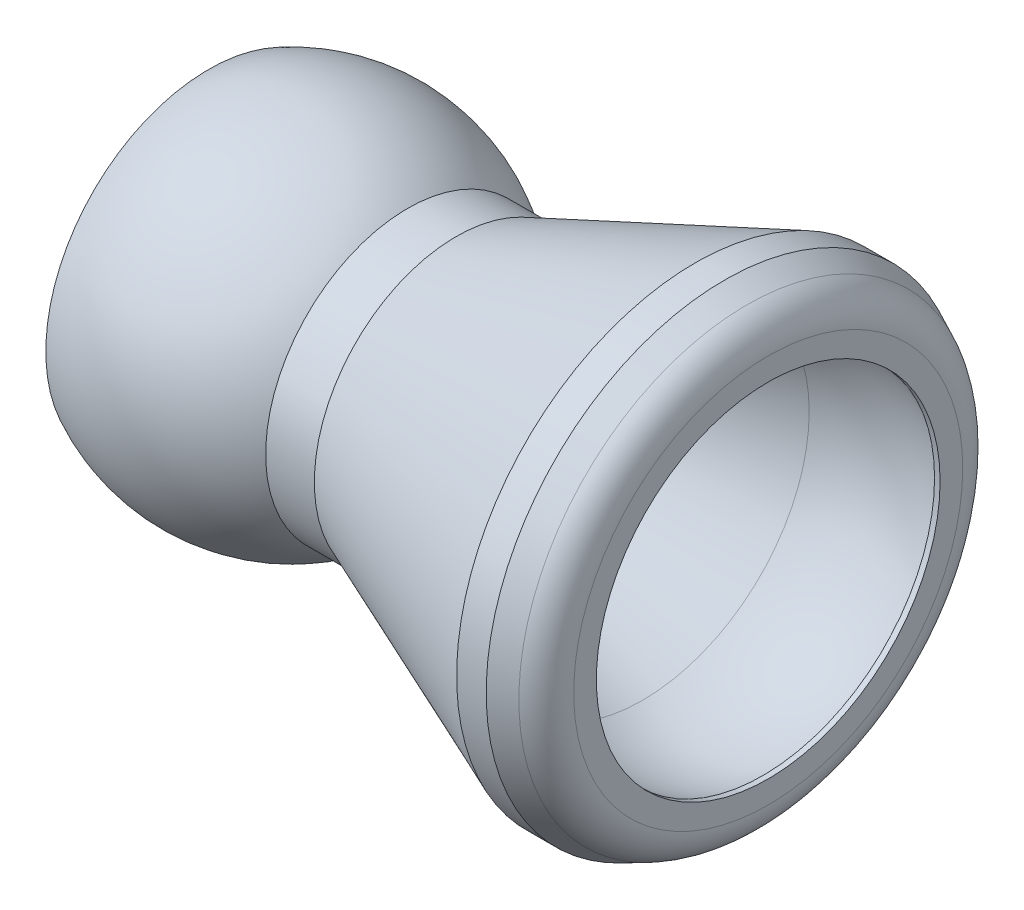
ISO-10303-21;
HEADER;
FILE_DESCRIPTION(('STEP AP214'),'2;1');
FILE_NAME('part.step','',(''),(''),'','','');
FILE_SCHEMA(('AUTOMOTIVE_DESIGN { 1 0 10303 214 1 1 1 1 }'));
ENDSEC;
DATA;
#1=APPLICATION_CONTEXT('core data for automotive mechanical design processes');
#2=APPLICATION_PROTOCOL_DEFINITION('international standard','automotive_design',2000,#1);
#3=PRODUCT_CONTEXT('',#1,'mechanical');
#4=PRODUCT('Part','Part','',(#3));
#5=PRODUCT_RELATED_PRODUCT_CATEGORY('part','',(#4));
#6=PRODUCT_DEFINITION_FORMATION('','',#4);
#7=PRODUCT_DEFINITION_CONTEXT('part definition',#1,'design');
#8=PRODUCT_DEFINITION('design','',#6,#7);
#9=PRODUCT_DEFINITION_SHAPE('','',#8);
#10=(LENGTH_UNIT() NAMED_UNIT(*) SI_UNIT(.MILLI.,.METRE.));
#11=(NAMED_UNIT(*) PLANE_ANGLE_UNIT() SI_UNIT($,.RADIAN.));
#12=(NAMED_UNIT(*) SI_UNIT($,.STERADIAN.) SOLID_ANGLE_UNIT());
#13=UNCERTAINTY_MEASURE_WITH_UNIT(LENGTH_MEASURE(1.E-05),#10,'distance_accuracy_value','');
#14=(GEOMETRIC_REPRESENTATION_CONTEXT(3) GLOBAL_UNCERTAINTY_ASSIGNED_CONTEXT((#13)) GLOBAL_UNIT_ASSIGNED_CONTEXT((#10,
#11,#12)) REPRESENTATION_CONTEXT('',''));
#15=CARTESIAN_POINT('',(0.,0.,0.));
#16=DIRECTION('',(0.,0.,1.));
#17=DIRECTION('',(1.,0.,0.));
#18=AXIS2_PLACEMENT_3D('',#15,#16,#17);
#19=CARTESIAN_POINT('',(-2.0066,0.,0.));
#20=DIRECTION('',(1.,0.,0.));
#21=DIRECTION('',(0.,0.,-1.));
#22=AXIS2_PLACEMENT_3D('',#19,#20,#21);
#23=SPHERICAL_SURFACE('',#22,6.17855);
#24=CARTESIAN_POINT('',(-4.32112556774985,0.,0.));
#25=DIRECTION('',(1.,0.,0.));
#26=DIRECTION('',(0.,0.,-1.));
#27=AXIS2_PLACEMENT_3D('',#24,#25,#26);
#28=CIRCLE('',#27,5.72865180463364);
#29=CARTESIAN_POINT('',(-4.32112556774985,0.,-5.72865180463364));
#30=VERTEX_POINT('',#29);
#31=EDGE_CURVE('E63',#30,#30,#28,.T.);
#32=CARTESIAN_POINT('',(-0.19013369078863,0.,0.));
#33=DIRECTION('',(1.,0.,0.));
#34=DIRECTION('',(0.,0.,-1.));
#35=AXIS2_PLACEMENT_3D('',#32,#33,#34);
#36=CIRCLE('',#35,5.9055);
#37=CARTESIAN_POINT('',(-0.19013369078863,0.,-5.9055));
#38=VERTEX_POINT('',#37);
#39=EDGE_CURVE('E9',#38,#38,#36,.T.);
#40=CARTESIAN_POINT('',(-4.32112556774985,0.,-5.72865180463364));
#41=CARTESIAN_POINT('',(-4.28040580624834,0.,-5.74510373864249));
#42=CARTESIAN_POINT('',(-4.2395105790668,0.,-5.7611213723148));
#43=CARTESIAN_POINT('',(-4.15738790785352,0.,-5.79228106964023));
#44=CARTESIAN_POINT('',(-4.11616046382178,0.,-5.80742313329335));
#45=CARTESIAN_POINT('',(-4.03339207341796,0.,-5.83682472123424));
#46=CARTESIAN_POINT('',(-3.99185112704587,0.,-5.85108424552203));
#47=CARTESIAN_POINT('',(-3.90847462949993,0.,-5.87871429336167));
#48=CARTESIAN_POINT('',(-3.86663907832606,0.,-5.89208481691354));
#49=CARTESIAN_POINT('',(-3.78269239182846,0.,-5.91793077756185));
#50=CARTESIAN_POINT('',(-3.74058125650471,0.,-5.93040621465829));
#51=CARTESIAN_POINT('',(-3.65610255057554,0.,-5.95445633133802));
#52=CARTESIAN_POINT('',(-3.61373497997011,0.,-5.9660310109213));
#53=CARTESIAN_POINT('',(-3.52876266817017,0.,-5.98827434904603));
#54=CARTESIAN_POINT('',(-3.48615792697566,0.,-5.99894300758747));
#55=CARTESIAN_POINT('',(-3.40073064674207,0.,-6.0193694526244));
#56=CARTESIAN_POINT('',(-3.357908107703,0.,-6.02912723911989));
#57=CARTESIAN_POINT('',(-3.27206470350322,0.,-6.04772750309391));
#58=CARTESIAN_POINT('',(-3.22904383834253,0.,-6.05656998057243));
#59=CARTESIAN_POINT('',(-3.14282334381785,0.,-6.073335605779));
#60=CARTESIAN_POINT('',(-3.09962371445386,0.,-6.08125875350703));
#61=CARTESIAN_POINT('',(-3.01306533472236,0.,-6.09618211649473));
#62=CARTESIAN_POINT('',(-2.96970658435485,0.,-6.10318233175439));
#63=CARTESIAN_POINT('',(-2.88284967817066,0.,-6.11625664675474));
#64=CARTESIAN_POINT('',(-2.83935152235398,0.,-6.12233074649542));
#65=CARTESIAN_POINT('',(-2.75223558421426,0.,-6.13355006851821));
#66=CARTESIAN_POINT('',(-2.70861780189122,0.,-6.13869529080032));
#67=CARTESIAN_POINT('',(-2.62128244407674,0.,-6.14805451833423));
#68=CARTESIAN_POINT('',(-2.5775648685853,0.,-6.15226852358604));
#69=CARTESIAN_POINT('',(-2.49004980314867,0.,-6.15976340091904));
#70=CARTESIAN_POINT('',(-2.44625231320348,0.,-6.16304427300023));
#71=CARTESIAN_POINT('',(-2.35859733391172,0.,-6.16867139215449));
#72=CARTESIAN_POINT('',(-2.31473984456515,0.,-6.17101763922755));
#73=CARTESIAN_POINT('',(-2.22698480880519,0.,-6.1747744415091));
#74=CARTESIAN_POINT('',(-2.1830872623918,0.,-6.1761849967176));
#75=CARTESIAN_POINT('',(-2.095272073047,0.,-6.17806977387984));
#76=CARTESIAN_POINT('',(-2.05135443011559,0.,-6.17854399583358));
#77=CARTESIAN_POINT('',(-1.9635190174216,0.,-6.17855589085396));
#78=CARTESIAN_POINT('',(-1.91960124765902,0.,-6.17809356392061));
#79=CARTESIAN_POINT('',(-1.83178555104721,0.,-6.17623257139039));
#80=CARTESIAN_POINT('',(-1.78788762419798,0.,-6.17483390579352));
#81=CARTESIAN_POINT('',(-1.70013157413467,0.,-6.17110087192015));
#82=CARTESIAN_POINT('',(-1.65627345092059,0.,-6.16876650364364));
#83=CARTESIAN_POINT('',(-1.56861695075032,0.,-6.16316312586618));
#84=CARTESIAN_POINT('',(-1.52481857379412,0.,-6.15989411636523));
#85=CARTESIAN_POINT('',(-1.4373014815955,0.,-6.15242294258179));
#86=CARTESIAN_POINT('',(-1.39358276635306,0.,-6.14822077829931));
#87=CARTESIAN_POINT('',(-1.30624487681422,0.,-6.13888520571123));
#88=CARTESIAN_POINT('',(-1.2626257025178,0.,-6.13375179740563));
#89=CARTESIAN_POINT('',(-1.17550672884432,0.,-6.1225560709626));
#90=CARTESIAN_POINT('',(-1.13200692946724,0.,-6.11649375282517));
#91=CARTESIAN_POINT('',(-1.04514648531354,0.,-6.10344296333276));
#92=CARTESIAN_POINT('',(-1.0017858405369,0.,-6.09645449197778));
#93=CARTESIAN_POINT('',(-0.9152234220336,0.,-6.08155457364188));
#94=CARTESIAN_POINT('',(-0.872021648306938,0.,-6.07364312666097));
#95=CARTESIAN_POINT('',(-0.785796615952367,0.,-6.0569008549146));
#96=CARTESIAN_POINT('',(-0.742773357324458,0.,-6.04807003014914));
#97=CARTESIAN_POINT('',(-0.65692491864444,0.,-6.02949301661185));
#98=CARTESIAN_POINT('',(-0.614099738592331,0.,-6.01974682784001));
#99=CARTESIAN_POINT('',(-0.528666928232228,0.,-5.99934352417063));
#100=CARTESIAN_POINT('',(-0.486059297924234,0.,-5.98868640927307));
#101=CARTESIAN_POINT('',(-0.40108096766228,0.,-5.96646607603127));
#102=CARTESIAN_POINT('',(-0.35871026770832,0.,-5.95490285768703));
#103=CARTESIAN_POINT('',(-0.274225039818692,0.,-5.93087566199019));
#104=CARTESIAN_POINT('',(-0.232110511883024,0.,-5.9184116846376));
#105=CARTESIAN_POINT('',(-0.19013369078863,0.,-5.9055));
#106=B_SPLINE_CURVE_WITH_KNOTS('',3,(#40,#41,#42,#43,#44,#45,#46,#47,#48,#49,#50,#51,#52,#53,
#54,#55,#56,#57,#58,#59,#60,#61,#62,#63,#64,#65,#66,#67,#68,#69,#70,#71,#72,#73,#74,#75,#76,#77,
#78,#79,#80,#81,#82,#83,#84,#85,#86,#87,#88,#89,#90,#91,#92,#93,#94,#95,#96,#97,#98,#99,#100,
#101,#102,#103,#104,#105),.UNSPECIFIED.,.F.,.F.,(4,2,2,2,2,2,2,2,2,2,2,2,2,2,2,2,2,2,2,2,2,2,2,
2,2,2,2,2,2,2,2,2,4),(0.,0.131750624105606,0.263501248211212,0.395251872316817,
0.527002496422423,0.658753120528028,0.790503744633634,0.922254368739239,1.05400499284484,
1.18575561695045,1.31750624105606,1.44925686516166,1.58100748926727,1.71275811337287,
1.84450873747848,1.97625936158408,2.10800998568969,2.23976060979529,2.3715112339009,
2.50326185800651,2.63501248211211,2.76676310621772,2.89851373032332,3.03026435442893,
3.16201497853453,3.29376560264014,3.42551622674574,3.55726685085135,3.68901747495695,
3.82076809906256,3.95251872316817,4.08426934727377,4.21601997137938),.UNSPECIFIED.);
#107=EDGE_CURVE('BSEAM14',#30,#38,#106,.T.);
#108=ORIENTED_EDGE('',*,*,#31,.F.);
#109=ORIENTED_EDGE('',*,*,#39,.T.);
#110=ORIENTED_EDGE('',*,*,#107,.T.);
#111=ORIENTED_EDGE('',*,*,#107,.F.);
#112=EDGE_LOOP('',(#108,#110,#109,#111));
#113=FACE_BOUND('',#112,.T.);
#114=ADVANCED_FACE('F14',(#113),#23,.F.);
#115=CARTESIAN_POINT('',(0.,0.,0.));
#116=DIRECTION('',(1.,0.,0.));
#117=DIRECTION('',(0.,0.,-1.));
#118=AXIS2_PLACEMENT_3D('',#115,#116,#117);
#119=CYLINDRICAL_SURFACE('',#118,5.9055);
#120=ORIENTED_EDGE('',*,*,#39,.F.);
#121=EDGE_LOOP('',(#120));
#122=FACE_BOUND('',#121,.T.);
#123=CARTESIAN_POINT('',(0.,0.,0.));
#124=DIRECTION('',(1.,0.,0.));
#125=DIRECTION('',(0.,0.,-1.));
#126=AXIS2_PLACEMENT_3D('',#123,#124,#125);
#127=CIRCLE('',#126,5.9055);
#128=CARTESIAN_POINT('',(0.,0.,-5.9055));
#129=VERTEX_POINT('',#128);
#130=EDGE_CURVE('E20',#129,#129,#127,.T.);
#131=ORIENTED_EDGE('',*,*,#130,.T.);
#132=EDGE_LOOP('',(#131));
#133=FACE_BOUND('',#132,.T.);
#134=ADVANCED_FACE('F71',(#122,#133),#119,.F.);
#135=CARTESIAN_POINT('',(0.,0.,-6.3551866858576));
#136=DIRECTION('',(1.,0.,0.));
#137=DIRECTION('',(0.,0.,-1.));
#138=AXIS2_PLACEMENT_3D('',#135,#136,#137);
#139=PLANE('',#138);
#140=CARTESIAN_POINT('',(0.,0.,0.));
#141=DIRECTION('',(1.,0.,0.));
#142=DIRECTION('',(0.,0.,-1.));
#143=AXIS2_PLACEMENT_3D('',#140,#141,#142);
#144=CIRCLE('',#143,6.6836121122634);
#145=CARTESIAN_POINT('',(0.,0.,-6.6836121122634));
#146=VERTEX_POINT('',#145);
#147=EDGE_CURVE('E24',#146,#146,#144,.T.);
#148=ORIENTED_EDGE('',*,*,#147,.T.);
#149=EDGE_LOOP('',(#148));
#150=FACE_BOUND('',#149,.T.);
#151=ORIENTED_EDGE('',*,*,#130,.F.);
#152=EDGE_LOOP('',(#151));
#153=FACE_BOUND('',#152,.T.);
#154=ADVANCED_FACE('F77',(#150,#153),#139,.T.);
#155=CARTESIAN_POINT('',(-1.27,0.,0.));
#156=DIRECTION('',(1.,0.,0.));
#157=DIRECTION('',(0.,0.,-1.));
#158=AXIS2_PLACEMENT_3D('',#155,#156,#157);
#159=TOROIDAL_SURFACE('',#158,6.6836121122634,1.27);
#160=ORIENTED_EDGE('',*,*,#147,.F.);
#161=EDGE_LOOP('',(#160));
#162=FACE_BOUND('',#161,.T.);
#163=CARTESIAN_POINT('',(-0.733274807589314,0.,0.));
#164=DIRECTION('',(1.,0.,0.));
#165=DIRECTION('',(0.,0.,-1.));
#166=AXIS2_PLACEMENT_3D('',#163,#164,#165);
#167=CIRCLE('',#166,7.83462300179995);
#168=CARTESIAN_POINT('',(-0.733274807589314,0.,-7.83462300179995));
#169=VERTEX_POINT('',#168);
#170=EDGE_CURVE('E28',#169,#169,#167,.T.);
#171=ORIENTED_EDGE('',*,*,#170,.T.);
#172=EDGE_LOOP('',(#171));
#173=FACE_BOUND('',#172,.T.);
#174=ADVANCED_FACE('F83',(#162,#173),#159,.T.);
#175=CARTESIAN_POINT('',(-0.733274807589314,0.,0.));
#176=DIRECTION('',(-1.,0.,0.));
#177=DIRECTION('',(0.,0.,1.));
#178=AXIS2_PLACEMENT_3D('',#175,#176,#177);
#179=CONICAL_SURFACE('',#178,7.83462300179995,0.436332312998584);
#180=CARTESIAN_POINT('',(-1.4986,0.,0.));
#181=DIRECTION('',(1.,0.,0.));
#182=DIRECTION('',(0.,0.,-1.));
#183=AXIS2_PLACEMENT_3D('',#180,#181,#182);
#184=CIRCLE('',#183,8.1915);
#185=CARTESIAN_POINT('',(-1.4986,0.,-8.1915));
#186=VERTEX_POINT('',#185);
#187=EDGE_CURVE('E33',#186,#186,#184,.T.);
#188=ORIENTED_EDGE('',*,*,#187,.T.);
#189=EDGE_LOOP('',(#188));
#190=FACE_BOUND('',#189,.T.);
#191=ORIENTED_EDGE('',*,*,#170,.F.);
#192=EDGE_LOOP('',(#191));
#193=FACE_BOUND('',#192,.T.);
#194=ADVANCED_FACE('F89',(#190,#193),#179,.T.);
#195=CARTESIAN_POINT('',(0.,0.,0.));
#196=DIRECTION('',(1.,0.,0.));
#197=DIRECTION('',(0.,0.,-1.));
#198=AXIS2_PLACEMENT_3D('',#195,#196,#197);
#199=CYLINDRICAL_SURFACE('',#198,8.1915);
#200=CARTESIAN_POINT('',(-2.5146,0.,0.));
#201=DIRECTION('',(1.,0.,0.));
#202=DIRECTION('',(0.,0.,-1.));
#203=AXIS2_PLACEMENT_3D('',#200,#201,#202);
#204=CIRCLE('',#203,8.1915);
#205=CARTESIAN_POINT('',(-2.5146,0.,-8.1915));
#206=VERTEX_POINT('',#205);
#207=EDGE_CURVE('E36',#206,#206,#204,.T.);
#208=ORIENTED_EDGE('',*,*,#207,.T.);
#209=EDGE_LOOP('',(#208));
#210=FACE_BOUND('',#209,.T.);
#211=ORIENTED_EDGE('',*,*,#187,.F.);
#212=EDGE_LOOP('',(#211));
#213=FACE_BOUND('',#212,.T.);
#214=ADVANCED_FACE('F93',(#210,#213),#199,.T.);
#215=CARTESIAN_POINT('',(-2.5146,0.,0.));
#216=DIRECTION('',(1.,0.,0.));
#217=DIRECTION('',(0.,0.,-1.));
#218=AXIS2_PLACEMENT_3D('',#215,#216,#217);
#219=CONICAL_SURFACE('',#218,8.1915,0.383972435438746);
#220=CARTESIAN_POINT('',(-10.7187703930191,0.,0.));
#221=DIRECTION('',(1.,0.,0.));
#222=DIRECTION('',(0.,0.,-1.));
#223=AXIS2_PLACEMENT_3D('',#220,#221,#222);
#224=CIRCLE('',#223,4.8768);
#225=CARTESIAN_POINT('',(-10.7187703930191,0.,-4.8768));
#226=VERTEX_POINT('',#225);
#227=EDGE_CURVE('E39',#226,#226,#224,.T.);
#228=ORIENTED_EDGE('',*,*,#227,.T.);
#229=EDGE_LOOP('',(#228));
#230=FACE_BOUND('',#229,.T.);
#231=ORIENTED_EDGE('',*,*,#207,.F.);
#232=EDGE_LOOP('',(#231));
#233=FACE_BOUND('',#232,.T.);
#234=ADVANCED_FACE('F97',(#230,#233),#219,.T.);
#235=CARTESIAN_POINT('',(0.,0.,0.));
#236=DIRECTION('',(1.,0.,0.));
#237=DIRECTION('',(0.,0.,-1.));
#238=AXIS2_PLACEMENT_3D('',#235,#236,#237);
#239=CYLINDRICAL_SURFACE('',#238,4.8768);
#240=CARTESIAN_POINT('',(-12.3906233161764,0.,0.));
#241=DIRECTION('',(1.,0.,0.));
#242=DIRECTION('',(0.,0.,-1.));
#243=AXIS2_PLACEMENT_3D('',#240,#241,#242);
#244=CIRCLE('',#243,4.8768);
#245=CARTESIAN_POINT('',(-12.3906233161764,0.,-4.87679999999999));
#246=VERTEX_POINT('',#245);
#247=EDGE_CURVE('E42',#246,#246,#244,.T.);
#248=ORIENTED_EDGE('',*,*,#247,.T.);
#249=EDGE_LOOP('',(#248));
#250=FACE_BOUND('',#249,.T.);
#251=ORIENTED_EDGE('',*,*,#227,.F.);
#252=EDGE_LOOP('',(#251));
#253=FACE_BOUND('',#252,.T.);
#254=ADVANCED_FACE('F101',(#250,#253),#239,.T.);
#255=CARTESIAN_POINT('',(-16.3576,0.,0.));
#256=DIRECTION('',(1.,0.,0.));
#257=DIRECTION('',(0.,0.,-1.));
#258=AXIS2_PLACEMENT_3D('',#255,#256,#257);
#259=SPHERICAL_SURFACE('',#258,6.2865);
#260=CARTESIAN_POINT('',(-19.2278,0.,0.));
#261=DIRECTION('',(1.,0.,0.));
#262=DIRECTION('',(0.,0.,-1.));
#263=AXIS2_PLACEMENT_3D('',#260,#261,#262);
#264=CIRCLE('',#263,5.59303443668998);
#265=CARTESIAN_POINT('',(-19.2278,0.,-5.59303443668998));
#266=VERTEX_POINT('',#265);
#267=EDGE_CURVE('E45',#266,#266,#264,.T.);
#268=CARTESIAN_POINT('',(-19.2278,0.,-5.59303443668998));
#269=CARTESIAN_POINT('',(-19.1603918117285,0.,-5.62762729036731));
#270=CARTESIAN_POINT('',(-19.0923577126382,0.,-5.66100037055364));
#271=CARTESIAN_POINT('',(-18.9551278219508,0.,-5.72526591728684));
#272=CARTESIAN_POINT('',(-18.8859320303538,0.,-5.7561583838337));
#273=CARTESIAN_POINT('',(-18.7464688837837,0.,-5.81542163663048));
#274=CARTESIAN_POINT('',(-18.6762015288107,0.,-5.84379242288039));
#275=CARTESIAN_POINT('',(-18.5346871922114,0.,-5.89797541350925));
#276=CARTESIAN_POINT('',(-18.4634402105851,0.,-5.92378761788819));
#277=CARTESIAN_POINT('',(-18.3200597289064,0.,-5.9728196548738));
#278=CARTESIAN_POINT('',(-18.2479262288541,0.,-5.99603948748046));
#279=CARTESIAN_POINT('',(-18.1028670065863,0.,-6.03985644204718));
#280=CARTESIAN_POINT('',(-18.0299412843707,0.,-6.06045356400724));
#281=CARTESIAN_POINT('',(-17.8833929417732,0.,-6.0989981699965));
#282=CARTESIAN_POINT('',(-17.8097703213913,0.,-6.11694565402571));
#283=CARTESIAN_POINT('',(-17.6619244195135,0.,-6.15016752485074));
#284=CARTESIAN_POINT('',(-17.5877011380176,0.,-6.16544191164656));
#285=CARTESIAN_POINT('',(-17.4387509355627,0.,-6.19329762167038));
#286=CARTESIAN_POINT('',(-17.3640240146038,0.,-6.20587894489837));
#287=CARTESIAN_POINT('',(-17.2141642133624,0.,-6.22833208204096));
#288=CARTESIAN_POINT('',(-17.1390313330799,0.,-6.23820389595555));
#289=CARTESIAN_POINT('',(-16.9884578239445,0.,-6.2552251104042));
#290=CARTESIAN_POINT('',(-16.9130171950917,0.,-6.26237451093824));
#291=CARTESIAN_POINT('',(-16.7619268018566,0.,-6.27394155321399));
#292=CARTESIAN_POINT('',(-16.6862770374744,0.,-6.2783591949557));
#293=CARTESIAN_POINT('',(-16.5348672595923,0.,-6.28445694507699));
#294=CARTESIAN_POINT('',(-16.4591072460924,0.,-6.28613705345657));
#295=CARTESIAN_POINT('',(-16.3075760005011,0.,-6.28675754068205));
#296=CARTESIAN_POINT('',(-16.2318047684095,0.,-6.28569791952793));
#297=CARTESIAN_POINT('',(-16.080350130825,0.,-6.28084033278121));
#298=CARTESIAN_POINT('',(-16.004666725332,0.,-6.27704236718861));
#299=CARTESIAN_POINT('',(-15.8534866713313,0.,-6.266713056117));
#300=CARTESIAN_POINT('',(-15.7779900228236,0.,-6.26018171063798));
#301=CARTESIAN_POINT('',(-15.6272821690588,0.,-6.24439417731281));
#302=CARTESIAN_POINT('',(-15.5520709638018,0.,-6.23513798946665));
#303=CARTESIAN_POINT('',(-15.4020323096834,0.,-6.21391287073385));
#304=CARTESIAN_POINT('',(-15.3272048608221,0.,-6.2019439398472));
#305=CARTESIAN_POINT('',(-15.178031531009,0.,-6.17530898035158));
#306=CARTESIAN_POINT('',(-15.1036856500572,0.,-6.16064295174262));
#307=CARTESIAN_POINT('',(-14.95557263809,0.,-6.12863296766128));
#308=CARTESIAN_POINT('',(-14.8818055070747,0.,-6.11128901218892));
#309=CARTESIAN_POINT('',(-14.7349464204884,0.,-6.07394584572054));
#310=CARTESIAN_POINT('',(-14.6618544649174,0.,-6.05394663472452));
#311=CARTESIAN_POINT('',(-14.5164412721639,0.,-6.0113190993962));
#312=CARTESIAN_POINT('',(-14.4441200349813,0.,-5.9886907750639));
#313=CARTESIAN_POINT('',(-14.3003428144997,0.,-5.94083459191899));
#314=CARTESIAN_POINT('',(-14.2288868312006,0.,-5.9156067331064));
#315=CARTESIAN_POINT('',(-14.0869335229397,0.,-5.86258445788703));
#316=CARTESIAN_POINT('',(-14.0164361979778,0.,-5.83479004148025));
#317=CARTESIAN_POINT('',(-13.8764923577818,0.,-5.7766709827864));
#318=CARTESIAN_POINT('',(-13.8070458425476,0.,-5.74634634049933));
#319=CARTESIAN_POINT('',(-13.6692943994059,0.,-5.68320646945438));
#320=CARTESIAN_POINT('',(-13.6009894714984,0.,-5.65039124069652));
#321=CARTESIAN_POINT('',(-13.4656104891695,0.,-5.58231309065918));
#322=CARTESIAN_POINT('',(-13.398536434748,0.,-5.54705016937971));
#323=CARTESIAN_POINT('',(-13.2657068736206,0.,-5.47412273172302));
#324=CARTESIAN_POINT('',(-13.1999513669147,0.,-5.43645821534581));
#325=CARTESIAN_POINT('',(-13.0698448630157,0.,-5.35877680945905));
#326=CARTESIAN_POINT('',(-13.0054938658227,0.,-5.3187599199495));
#327=CARTESIAN_POINT('',(-12.8782804653202,0.,-5.23642611966533));
#328=CARTESIAN_POINT('',(-12.8154180620108,0.,-5.19410920889071));
#329=CARTESIAN_POINT('',(-12.691264142719,0.,-5.10723051928415));
#330=CARTESIAN_POINT('',(-12.6299726267366,0.,-5.06266874045221));
#331=CARTESIAN_POINT('',(-12.5090401440299,0.,-4.97135916800005));
#332=CARTESIAN_POINT('',(-12.4493991773057,0.,-4.92461137437983));
#333=CARTESIAN_POINT('',(-12.3906233161764,0.,-4.87679999999999));
#334=B_SPLINE_CURVE_WITH_KNOTS('',3,(#268,#269,#270,#271,#272,#273,#274,#275,#276,#277,#278,
#279,#280,#281,#282,#283,#284,#285,#286,#287,#288,#289,#290,#291,#292,#293,#294,#295,#296,#297,
#298,#299,#300,#301,#302,#303,#304,#305,#306,#307,#308,#309,#310,#311,#312,#313,#314,#315,#316,
#317,#318,#319,#320,#321,#322,#323,#324,#325,#326,#327,#328,#329,#330,#331,#332,#333),
.UNSPECIFIED.,.F.,.F.,(4,2,2,2,2,2,2,2,2,2,2,2,2,2,2,2,2,2,2,2,2,2,2,2,2,2,2,2,2,2,2,2,4),(0.,
0.227286395124281,0.454572790248558,0.681859185372835,0.909145580497113,1.13643197562139,
1.36371837074567,1.59100476586995,1.81829116099423,2.04557755611851,2.27286395124278,
2.50015034636706,2.72743674149134,2.95472313661562,3.18200953173989,3.40929592686417,
3.63658232198845,3.86386871711273,4.09115511223701,4.31844150736128,4.54572790248556,
4.77301429760984,5.00030069273412,5.2275870878584,5.45487348298267,5.68215987810695,
5.90944627323123,6.13673266835551,6.36401906347979,6.59130545860406,6.81859185372834,
7.04587824885262,7.2731646439769),.UNSPECIFIED.);
#335=EDGE_CURVE('BSEAM105',#266,#246,#334,.T.);
#336=ORIENTED_EDGE('',*,*,#267,.T.);
#337=ORIENTED_EDGE('',*,*,#247,.F.);
#338=ORIENTED_EDGE('',*,*,#335,.T.);
#339=ORIENTED_EDGE('',*,*,#335,.F.);
#340=EDGE_LOOP('',(#336,#338,#337,#339));
#341=FACE_BOUND('',#340,.T.);
#342=ADVANCED_FACE('F105',(#341),#259,.T.);
#343=CARTESIAN_POINT('',(-19.2278,0.,-6.35518668585758));
#344=DIRECTION('',(-1.,0.,0.));
#345=DIRECTION('',(0.,0.,1.));
#346=AXIS2_PLACEMENT_3D('',#343,#344,#345);
#347=PLANE('',#346);
#348=CARTESIAN_POINT('',(-19.2278,0.,0.));
#349=DIRECTION('',(1.,0.,0.));
#350=DIRECTION('',(0.,0.,-1.));
#351=AXIS2_PLACEMENT_3D('',#348,#349,#350);
#352=CIRCLE('',#351,4.5085);
#353=CARTESIAN_POINT('',(-19.2278,0.,-4.5085));
#354=VERTEX_POINT('',#353);
#355=EDGE_CURVE('E48',#354,#354,#352,.T.);
#356=ORIENTED_EDGE('',*,*,#355,.T.);
#357=EDGE_LOOP('',(#356));
#358=FACE_BOUND('',#357,.T.);
#359=ORIENTED_EDGE('',*,*,#267,.F.);
#360=EDGE_LOOP('',(#359));
#361=FACE_BOUND('',#360,.T.);
#362=ADVANCED_FACE('F109',(#358,#361),#347,.T.);
#363=CARTESIAN_POINT('',(-19.2278,0.,0.));
#364=DIRECTION('',(-1.,0.,0.));
#365=DIRECTION('',(0.,0.,1.));
#366=AXIS2_PLACEMENT_3D('',#363,#364,#365);
#367=CONICAL_SURFACE('',#366,4.5085,0.383972435438757);
#368=CARTESIAN_POINT('',(-18.7877295574626,0.,0.));
#369=DIRECTION('',(1.,0.,0.));
#370=DIRECTION('',(0.,0.,-1.));
#371=AXIS2_PLACEMENT_3D('',#368,#369,#370);
#372=CIRCLE('',#371,4.3307);
#373=CARTESIAN_POINT('',(-18.7877295574626,0.,-4.3307));
#374=VERTEX_POINT('',#373);
#375=EDGE_CURVE('E51',#374,#374,#372,.T.);
#376=ORIENTED_EDGE('',*,*,#375,.T.);
#377=EDGE_LOOP('',(#376));
#378=FACE_BOUND('',#377,.T.);
#379=ORIENTED_EDGE('',*,*,#355,.F.);
#380=EDGE_LOOP('',(#379));
#381=FACE_BOUND('',#380,.T.);
#382=ADVANCED_FACE('F113',(#378,#381),#367,.F.);
#383=CARTESIAN_POINT('',(0.,0.,0.));
#384=DIRECTION('',(1.,0.,0.));
#385=DIRECTION('',(0.,0.,-1.));
#386=AXIS2_PLACEMENT_3D('',#383,#384,#385);
#387=CYLINDRICAL_SURFACE('',#386,4.3307);
#388=CARTESIAN_POINT('',(-14.6273547562583,0.,0.));
#389=DIRECTION('',(1.,0.,0.));
#390=DIRECTION('',(0.,0.,-1.));
#391=AXIS2_PLACEMENT_3D('',#388,#389,#390);
#392=CIRCLE('',#391,4.3307);
#393=CARTESIAN_POINT('',(-14.6273547562583,0.,-4.3307));
#394=VERTEX_POINT('',#393);
#395=EDGE_CURVE('E54',#394,#394,#392,.T.);
#396=ORIENTED_EDGE('',*,*,#395,.T.);
#397=EDGE_LOOP('',(#396));
#398=FACE_BOUND('',#397,.T.);
#399=ORIENTED_EDGE('',*,*,#375,.F.);
#400=EDGE_LOOP('',(#399));
#401=FACE_BOUND('',#400,.T.);
#402=ADVANCED_FACE('F117',(#398,#401),#387,.F.);
#403=CARTESIAN_POINT('',(-12.8016,0.,0.));
#404=DIRECTION('',(-1.,0.,0.));
#405=DIRECTION('',(0.,0.,1.));
#406=AXIS2_PLACEMENT_3D('',#403,#404,#405);
#407=CONICAL_SURFACE('',#406,3.2766,0.523598775598299);
#408=ORIENTED_EDGE('',*,*,#395,.F.);
#409=EDGE_LOOP('',(#408));
#410=FACE_BOUND('',#409,.T.);
#411=CARTESIAN_POINT('',(-12.8016,0.,0.));
#412=DIRECTION('',(1.,0.,0.));
#413=DIRECTION('',(0.,0.,-1.));
#414=AXIS2_PLACEMENT_3D('',#411,#412,#413);
#415=CIRCLE('',#414,3.2766);
#416=CARTESIAN_POINT('',(-12.8016,0.,-3.2766));
#417=VERTEX_POINT('',#416);
#418=EDGE_CURVE('E57',#417,#417,#415,.T.);
#419=ORIENTED_EDGE('',*,*,#418,.T.);
#420=EDGE_LOOP('',(#419));
#421=FACE_BOUND('',#420,.T.);
#422=ADVANCED_FACE('F121',(#410,#421),#407,.F.);
#423=CARTESIAN_POINT('',(0.,0.,0.));
#424=DIRECTION('',(1.,0.,0.));
#425=DIRECTION('',(0.,0.,-1.));
#426=AXIS2_PLACEMENT_3D('',#423,#424,#425);
#427=CYLINDRICAL_SURFACE('',#426,3.2766);
#428=ORIENTED_EDGE('',*,*,#418,.F.);
#429=EDGE_LOOP('',(#428));
#430=FACE_BOUND('',#429,.T.);
#431=CARTESIAN_POINT('',(-10.3901667532944,0.,0.));
#432=DIRECTION('',(1.,0.,0.));
#433=DIRECTION('',(0.,0.,-1.));
#434=AXIS2_PLACEMENT_3D('',#431,#432,#433);
#435=CIRCLE('',#434,3.2766);
#436=CARTESIAN_POINT('',(-10.3901667532944,0.,-3.2766));
#437=VERTEX_POINT('',#436);
#438=EDGE_CURVE('E60',#437,#437,#435,.T.);
#439=ORIENTED_EDGE('',*,*,#438,.T.);
#440=EDGE_LOOP('',(#439));
#441=FACE_BOUND('',#440,.T.);
#442=ADVANCED_FACE('F125',(#430,#441),#427,.F.);
#443=CARTESIAN_POINT('',(-10.3901667532944,0.,0.));
#444=DIRECTION('',(1.,0.,0.));
#445=DIRECTION('',(0.,0.,-1.));
#446=AXIS2_PLACEMENT_3D('',#443,#444,#445);
#447=CONICAL_SURFACE('',#446,3.2766,0.383972435438746);
#448=ORIENTED_EDGE('',*,*,#31,.T.);
#449=EDGE_LOOP('',(#448));
#450=FACE_BOUND('',#449,.T.);
#451=ORIENTED_EDGE('',*,*,#438,.F.);
#452=EDGE_LOOP('',(#451));
#453=FACE_BOUND('',#452,.T.);
#454=ADVANCED_FACE('F67',(#450,#453),#447,.F.);
#455=CLOSED_SHELL('',(#114,#134,#154,#174,#194,#214,#234,#254,#342,#362,#382,#402,#422,#442,#454));
#456=MANIFOLD_SOLID_BREP('B1',#455);
#457=ADVANCED_BREP_SHAPE_REPRESENTATION('',(#18,#456),#14);
#458=SHAPE_DEFINITION_REPRESENTATION(#9,#457);
ENDSEC;
END-ISO-10303-21;
